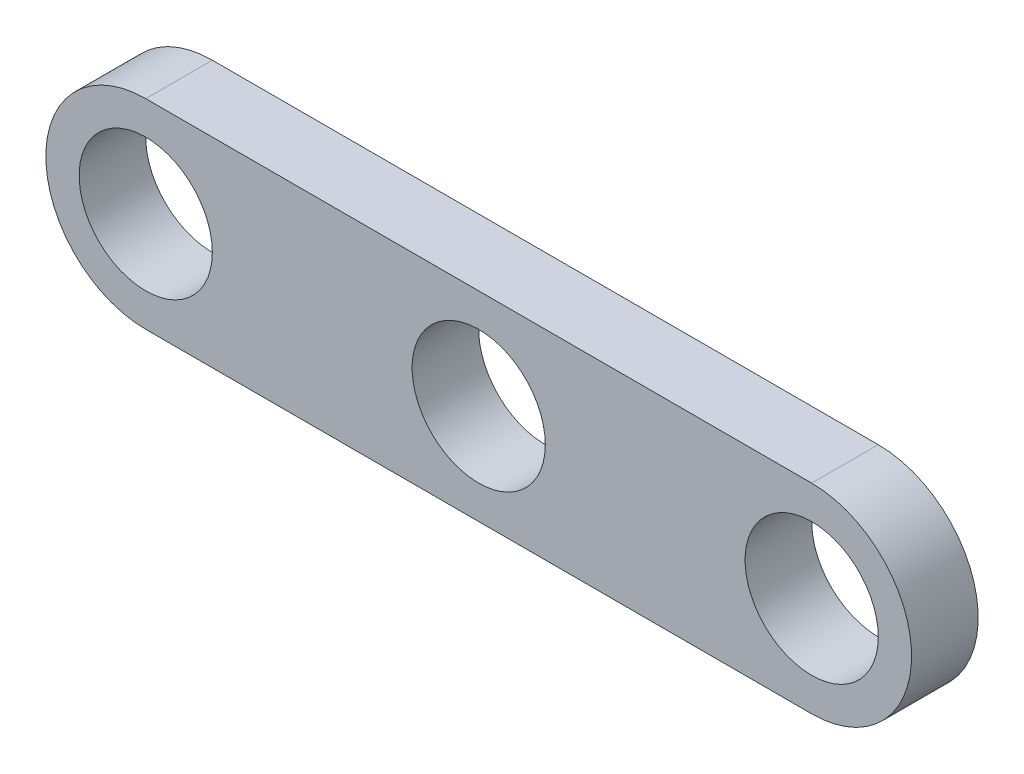
ISO-10303-21;
HEADER;
FILE_DESCRIPTION(('STEP AP214'),'2;1');
FILE_NAME('part.step','',(''),(''),'','','');
FILE_SCHEMA(('AUTOMOTIVE_DESIGN { 1 0 10303 214 1 1 1 1 }'));
ENDSEC;
DATA;
#1=APPLICATION_CONTEXT('core data for automotive mechanical design processes');
#2=APPLICATION_PROTOCOL_DEFINITION('international standard','automotive_design',2000,#1);
#3=PRODUCT_CONTEXT('',#1,'mechanical');
#4=PRODUCT('Part','Part','',(#3));
#5=PRODUCT_RELATED_PRODUCT_CATEGORY('part','',(#4));
#6=PRODUCT_DEFINITION_FORMATION('','',#4);
#7=PRODUCT_DEFINITION_CONTEXT('part definition',#1,'design');
#8=PRODUCT_DEFINITION('design','',#6,#7);
#9=PRODUCT_DEFINITION_SHAPE('','',#8);
#10=(LENGTH_UNIT() NAMED_UNIT(*) SI_UNIT(.MILLI.,.METRE.));
#11=(NAMED_UNIT(*) PLANE_ANGLE_UNIT() SI_UNIT($,.RADIAN.));
#12=(NAMED_UNIT(*) SI_UNIT($,.STERADIAN.) SOLID_ANGLE_UNIT());
#13=UNCERTAINTY_MEASURE_WITH_UNIT(LENGTH_MEASURE(1.E-05),#10,'distance_accuracy_value','');
#14=(GEOMETRIC_REPRESENTATION_CONTEXT(3) GLOBAL_UNCERTAINTY_ASSIGNED_CONTEXT((#13)) GLOBAL_UNIT_ASSIGNED_CONTEXT((#10,
#11,#12)) REPRESENTATION_CONTEXT('',''));
#15=CARTESIAN_POINT('',(0.,0.,0.));
#16=DIRECTION('',(0.,0.,1.));
#17=DIRECTION('',(1.,0.,0.));
#18=AXIS2_PLACEMENT_3D('',#15,#16,#17);
#19=CARTESIAN_POINT('',(-20.,3.,2.));
#20=DIRECTION('',(0.,0.,-1.));
#21=DIRECTION('',(-1.,0.,0.));
#22=AXIS2_PLACEMENT_3D('',#19,#20,#21);
#23=CYLINDRICAL_SURFACE('',#22,3.);
#24=CARTESIAN_POINT('',(-20.,3.,0.));
#25=DIRECTION('',(0.,0.,1.));
#26=DIRECTION('',(1.,0.,0.));
#27=AXIS2_PLACEMENT_3D('',#24,#25,#26);
#28=CIRCLE('',#27,3.);
#29=CARTESIAN_POINT('',(-20.,6.,0.));
#30=VERTEX_POINT('',#29);
#31=CARTESIAN_POINT('',(-20.,0.,0.));
#32=VERTEX_POINT('',#31);
#33=EDGE_CURVE('E114',#30,#32,#28,.T.);
#34=ORIENTED_EDGE('',*,*,#33,.T.);
#35=DIRECTION('',(0.,0.,-1.));
#36=VECTOR('',#35,1.);
#37=CARTESIAN_POINT('',(-20.,0.,2.));
#38=LINE('',#37,#36);
#39=CARTESIAN_POINT('',(-20.,0.,2.));
#40=VERTEX_POINT('',#39);
#41=EDGE_CURVE('E11',#40,#32,#38,.T.);
#42=ORIENTED_EDGE('',*,*,#41,.F.);
#43=CARTESIAN_POINT('',(-20.,3.,2.));
#44=DIRECTION('',(0.,0.,1.));
#45=DIRECTION('',(1.,0.,0.));
#46=AXIS2_PLACEMENT_3D('',#43,#44,#45);
#47=CIRCLE('',#46,3.);
#48=CARTESIAN_POINT('',(-20.,6.,2.));
#49=VERTEX_POINT('',#48);
#50=EDGE_CURVE('E86',#49,#40,#47,.T.);
#51=ORIENTED_EDGE('',*,*,#50,.F.);
#52=DIRECTION('',(0.,0.,-1.));
#53=VECTOR('',#52,1.);
#54=CARTESIAN_POINT('',(-20.,6.,2.));
#55=LINE('',#54,#53);
#56=EDGE_CURVE('E113',#49,#30,#55,.T.);
#57=ORIENTED_EDGE('',*,*,#56,.T.);
#58=EDGE_LOOP('',(#34,#42,#51,#57));
#59=FACE_BOUND('',#58,.T.);
#60=ADVANCED_FACE('F41',(#59),#23,.T.);
#61=CARTESIAN_POINT('',(0.,0.,2.));
#62=DIRECTION('',(0.,-1.,0.));
#63=DIRECTION('',(0.,0.,-1.));
#64=AXIS2_PLACEMENT_3D('',#61,#62,#63);
#65=PLANE('',#64);
#66=DIRECTION('',(-1.,0.,0.));
#67=VECTOR('',#66,1.);
#68=CARTESIAN_POINT('',(0.,0.,0.));
#69=LINE('',#68,#67);
#70=CARTESIAN_POINT('',(0.,0.,0.));
#71=VERTEX_POINT('',#70);
#72=EDGE_CURVE('E96',#71,#32,#69,.T.);
#73=ORIENTED_EDGE('',*,*,#72,.F.);
#74=DIRECTION('',(0.,0.,-1.));
#75=VECTOR('',#74,1.);
#76=CARTESIAN_POINT('',(0.,0.,2.));
#77=LINE('',#76,#75);
#78=CARTESIAN_POINT('',(0.,0.,2.));
#79=VERTEX_POINT('',#78);
#80=EDGE_CURVE('E51',#79,#71,#77,.T.);
#81=ORIENTED_EDGE('',*,*,#80,.F.);
#82=DIRECTION('',(-1.,0.,0.));
#83=VECTOR('',#82,1.);
#84=CARTESIAN_POINT('',(0.,0.,2.));
#85=LINE('',#84,#83);
#86=EDGE_CURVE('E94',#79,#40,#85,.T.);
#87=ORIENTED_EDGE('',*,*,#86,.T.);
#88=ORIENTED_EDGE('',*,*,#41,.T.);
#89=EDGE_LOOP('',(#73,#81,#87,#88));
#90=FACE_BOUND('',#89,.T.);
#91=ADVANCED_FACE('F93',(#90),#65,.T.);
#92=CARTESIAN_POINT('',(0.,3.,2.));
#93=DIRECTION('',(0.,0.,-1.));
#94=DIRECTION('',(-1.,0.,0.));
#95=AXIS2_PLACEMENT_3D('',#92,#93,#94);
#96=CYLINDRICAL_SURFACE('',#95,3.);
#97=CARTESIAN_POINT('',(0.,3.,0.));
#98=DIRECTION('',(0.,0.,1.));
#99=DIRECTION('',(1.,0.,0.));
#100=AXIS2_PLACEMENT_3D('',#97,#98,#99);
#101=CIRCLE('',#100,3.);
#102=CARTESIAN_POINT('',(0.,6.,0.));
#103=VERTEX_POINT('',#102);
#104=EDGE_CURVE('E75',#71,#103,#101,.T.);
#105=ORIENTED_EDGE('',*,*,#104,.T.);
#106=DIRECTION('',(0.,0.,-1.));
#107=VECTOR('',#106,1.);
#108=CARTESIAN_POINT('',(0.,6.,2.));
#109=LINE('',#108,#107);
#110=CARTESIAN_POINT('',(0.,6.,2.));
#111=VERTEX_POINT('',#110);
#112=EDGE_CURVE('E98',#111,#103,#109,.T.);
#113=ORIENTED_EDGE('',*,*,#112,.F.);
#114=CARTESIAN_POINT('',(0.,3.,2.));
#115=DIRECTION('',(0.,0.,1.));
#116=DIRECTION('',(1.,0.,0.));
#117=AXIS2_PLACEMENT_3D('',#114,#115,#116);
#118=CIRCLE('',#117,3.);
#119=EDGE_CURVE('E100',#79,#111,#118,.T.);
#120=ORIENTED_EDGE('',*,*,#119,.F.);
#121=ORIENTED_EDGE('',*,*,#80,.T.);
#122=EDGE_LOOP('',(#105,#113,#120,#121));
#123=FACE_BOUND('',#122,.T.);
#124=ADVANCED_FACE('F101',(#123),#96,.T.);
#125=CARTESIAN_POINT('',(0.,6.,2.));
#126=DIRECTION('',(0.,-1.,0.));
#127=DIRECTION('',(1.,0.,0.));
#128=AXIS2_PLACEMENT_3D('',#125,#126,#127);
#129=PLANE('',#128);
#130=DIRECTION('',(-1.,0.,0.));
#131=VECTOR('',#130,1.);
#132=CARTESIAN_POINT('',(0.,6.,0.));
#133=LINE('',#132,#131);
#134=EDGE_CURVE('E81',#103,#30,#133,.T.);
#135=ORIENTED_EDGE('',*,*,#134,.T.);
#136=ORIENTED_EDGE('',*,*,#56,.F.);
#137=DIRECTION('',(-1.,0.,0.));
#138=VECTOR('',#137,1.);
#139=CARTESIAN_POINT('',(0.,6.,2.));
#140=LINE('',#139,#138);
#141=EDGE_CURVE('E60',#111,#49,#140,.T.);
#142=ORIENTED_EDGE('',*,*,#141,.F.);
#143=ORIENTED_EDGE('',*,*,#112,.T.);
#144=EDGE_LOOP('',(#135,#136,#142,#143));
#145=FACE_BOUND('',#144,.T.);
#146=ADVANCED_FACE('F170',(#145),#129,.F.);
#147=CARTESIAN_POINT('',(0.,0.,2.));
#148=DIRECTION('',(0.,0.,1.));
#149=DIRECTION('',(1.,0.,0.));
#150=AXIS2_PLACEMENT_3D('',#147,#148,#149);
#151=PLANE('',#150);
#152=CARTESIAN_POINT('',(-20.,3.,2.));
#153=DIRECTION('',(0.,0.,1.));
#154=DIRECTION('',(1.,0.,0.));
#155=AXIS2_PLACEMENT_3D('',#152,#153,#154);
#156=CIRCLE('',#155,2.);
#157=CARTESIAN_POINT('',(-18.,3.,2.));
#158=VERTEX_POINT('',#157);
#159=EDGE_CURVE('E132',#158,#158,#156,.T.);
#160=ORIENTED_EDGE('',*,*,#159,.F.);
#161=EDGE_LOOP('',(#160));
#162=FACE_BOUND('',#161,.T.);
#163=CARTESIAN_POINT('',(-10.,3.,2.));
#164=DIRECTION('',(0.,0.,1.));
#165=DIRECTION('',(1.,0.,0.));
#166=AXIS2_PLACEMENT_3D('',#163,#164,#165);
#167=CIRCLE('',#166,2.);
#168=CARTESIAN_POINT('',(-8.,3.,2.));
#169=VERTEX_POINT('',#168);
#170=EDGE_CURVE('E242',#169,#169,#167,.T.);
#171=ORIENTED_EDGE('',*,*,#170,.F.);
#172=EDGE_LOOP('',(#171));
#173=FACE_BOUND('',#172,.T.);
#174=CARTESIAN_POINT('',(0.,3.,2.));
#175=DIRECTION('',(0.,0.,1.));
#176=DIRECTION('',(1.,0.,0.));
#177=AXIS2_PLACEMENT_3D('',#174,#175,#176);
#178=CIRCLE('',#177,2.);
#179=CARTESIAN_POINT('',(2.,3.,2.));
#180=VERTEX_POINT('',#179);
#181=EDGE_CURVE('E245',#180,#180,#178,.T.);
#182=ORIENTED_EDGE('',*,*,#181,.F.);
#183=EDGE_LOOP('',(#182));
#184=FACE_BOUND('',#183,.T.);
#185=ORIENTED_EDGE('',*,*,#50,.T.);
#186=ORIENTED_EDGE('',*,*,#86,.F.);
#187=ORIENTED_EDGE('',*,*,#119,.T.);
#188=ORIENTED_EDGE('',*,*,#141,.T.);
#189=EDGE_LOOP('',(#185,#186,#187,#188));
#190=FACE_BOUND('',#189,.T.);
#191=ADVANCED_FACE('F104',(#162,#173,#184,#190),#151,.T.);
#192=CARTESIAN_POINT('',(0.,0.,0.));
#193=DIRECTION('',(0.,0.,1.));
#194=DIRECTION('',(1.,0.,0.));
#195=AXIS2_PLACEMENT_3D('',#192,#193,#194);
#196=PLANE('',#195);
#197=CARTESIAN_POINT('',(-20.,3.,0.));
#198=DIRECTION('',(0.,0.,1.));
#199=DIRECTION('',(1.,0.,0.));
#200=AXIS2_PLACEMENT_3D('',#197,#198,#199);
#201=CIRCLE('',#200,2.);
#202=CARTESIAN_POINT('',(-18.,3.,0.));
#203=VERTEX_POINT('',#202);
#204=EDGE_CURVE('E44',#203,#203,#201,.T.);
#205=ORIENTED_EDGE('',*,*,#204,.T.);
#206=EDGE_LOOP('',(#205));
#207=FACE_BOUND('',#206,.T.);
#208=CARTESIAN_POINT('',(-10.,3.,0.));
#209=DIRECTION('',(0.,0.,1.));
#210=DIRECTION('',(1.,0.,0.));
#211=AXIS2_PLACEMENT_3D('',#208,#209,#210);
#212=CIRCLE('',#211,2.);
#213=CARTESIAN_POINT('',(-8.,3.,0.));
#214=VERTEX_POINT('',#213);
#215=EDGE_CURVE('E131',#214,#214,#212,.T.);
#216=ORIENTED_EDGE('',*,*,#215,.T.);
#217=EDGE_LOOP('',(#216));
#218=FACE_BOUND('',#217,.T.);
#219=CARTESIAN_POINT('',(0.,3.,0.));
#220=DIRECTION('',(0.,0.,1.));
#221=DIRECTION('',(1.,0.,0.));
#222=AXIS2_PLACEMENT_3D('',#219,#220,#221);
#223=CIRCLE('',#222,2.);
#224=CARTESIAN_POINT('',(2.,3.,0.));
#225=VERTEX_POINT('',#224);
#226=EDGE_CURVE('E128',#225,#225,#223,.T.);
#227=ORIENTED_EDGE('',*,*,#226,.T.);
#228=EDGE_LOOP('',(#227));
#229=FACE_BOUND('',#228,.T.);
#230=ORIENTED_EDGE('',*,*,#33,.F.);
#231=ORIENTED_EDGE('',*,*,#134,.F.);
#232=ORIENTED_EDGE('',*,*,#104,.F.);
#233=ORIENTED_EDGE('',*,*,#72,.T.);
#234=EDGE_LOOP('',(#230,#231,#232,#233));
#235=FACE_BOUND('',#234,.T.);
#236=ADVANCED_FACE('F141',(#207,#218,#229,#235),#196,.F.);
#237=CARTESIAN_POINT('',(0.,3.,-4.));
#238=DIRECTION('',(0.,0.,1.));
#239=DIRECTION('',(1.,0.,0.));
#240=AXIS2_PLACEMENT_3D('',#237,#238,#239);
#241=CYLINDRICAL_SURFACE('',#240,2.);
#242=ORIENTED_EDGE('',*,*,#181,.T.);
#243=EDGE_LOOP('',(#242));
#244=FACE_BOUND('',#243,.T.);
#245=ORIENTED_EDGE('',*,*,#226,.F.);
#246=EDGE_LOOP('',(#245));
#247=FACE_BOUND('',#246,.T.);
#248=ADVANCED_FACE('F151',(#244,#247),#241,.F.);
#249=CARTESIAN_POINT('',(-10.,3.,-4.));
#250=DIRECTION('',(0.,0.,1.));
#251=DIRECTION('',(1.,0.,0.));
#252=AXIS2_PLACEMENT_3D('',#249,#250,#251);
#253=CYLINDRICAL_SURFACE('',#252,2.);
#254=ORIENTED_EDGE('',*,*,#170,.T.);
#255=EDGE_LOOP('',(#254));
#256=FACE_BOUND('',#255,.T.);
#257=ORIENTED_EDGE('',*,*,#215,.F.);
#258=EDGE_LOOP('',(#257));
#259=FACE_BOUND('',#258,.T.);
#260=ADVANCED_FACE('F145',(#256,#259),#253,.F.);
#261=CARTESIAN_POINT('',(-20.,3.,-4.));
#262=DIRECTION('',(0.,0.,1.));
#263=DIRECTION('',(1.,0.,0.));
#264=AXIS2_PLACEMENT_3D('',#261,#262,#263);
#265=CYLINDRICAL_SURFACE('',#264,2.);
#266=ORIENTED_EDGE('',*,*,#159,.T.);
#267=EDGE_LOOP('',(#266));
#268=FACE_BOUND('',#267,.T.);
#269=ORIENTED_EDGE('',*,*,#204,.F.);
#270=EDGE_LOOP('',(#269));
#271=FACE_BOUND('',#270,.T.);
#272=ADVANCED_FACE('F143',(#268,#271),#265,.F.);
#273=CLOSED_SHELL('',(#60,#91,#124,#146,#191,#236,#248,#260,#272));
#274=MANIFOLD_SOLID_BREP('B2',#273);
#275=ADVANCED_BREP_SHAPE_REPRESENTATION('',(#18,#274),#14);
#276=SHAPE_DEFINITION_REPRESENTATION(#9,#275);
ENDSEC;
END-ISO-10303-21;
